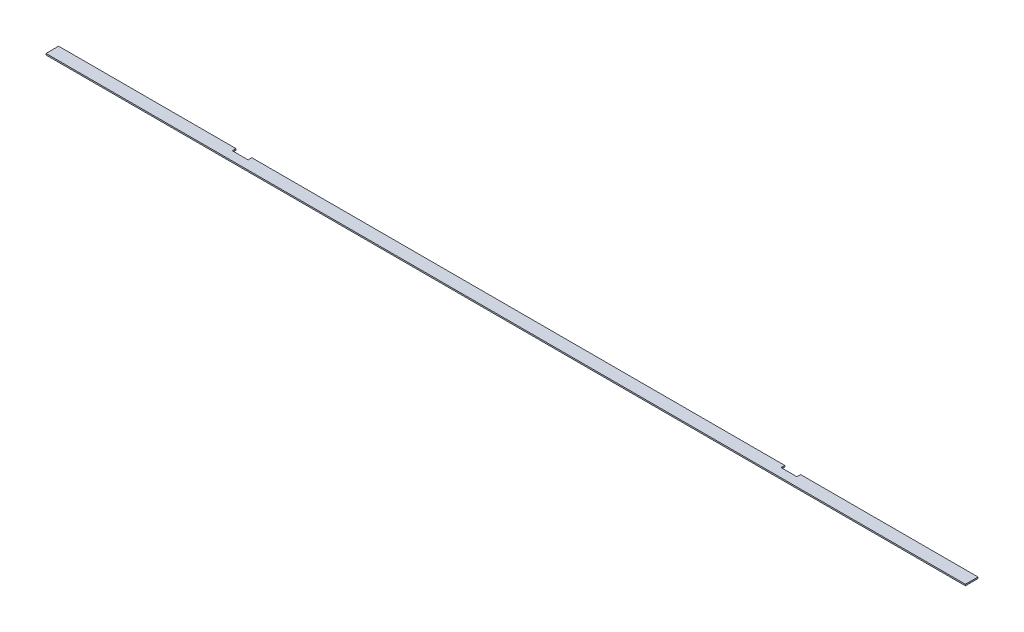
ISO-10303-21;
HEADER;
FILE_DESCRIPTION(('STEP AP214'),'2;1');
FILE_NAME('part.step','',(''),(''),'','','');
FILE_SCHEMA(('AUTOMOTIVE_DESIGN { 1 0 10303 214 1 1 1 1 }'));
ENDSEC;
DATA;
#1=APPLICATION_CONTEXT('core data for automotive mechanical design processes');
#2=APPLICATION_PROTOCOL_DEFINITION('international standard','automotive_design',2000,#1);
#3=PRODUCT_CONTEXT('',#1,'mechanical');
#4=PRODUCT('Part','Part','',(#3));
#5=PRODUCT_RELATED_PRODUCT_CATEGORY('part','',(#4));
#6=PRODUCT_DEFINITION_FORMATION('','',#4);
#7=PRODUCT_DEFINITION_CONTEXT('part definition',#1,'design');
#8=PRODUCT_DEFINITION('design','',#6,#7);
#9=PRODUCT_DEFINITION_SHAPE('','',#8);
#10=(LENGTH_UNIT() NAMED_UNIT(*) SI_UNIT(.MILLI.,.METRE.));
#11=(NAMED_UNIT(*) PLANE_ANGLE_UNIT() SI_UNIT($,.RADIAN.));
#12=(NAMED_UNIT(*) SI_UNIT($,.STERADIAN.) SOLID_ANGLE_UNIT());
#13=UNCERTAINTY_MEASURE_WITH_UNIT(LENGTH_MEASURE(1.E-05),#10,'distance_accuracy_value','');
#14=(GEOMETRIC_REPRESENTATION_CONTEXT(3) GLOBAL_UNCERTAINTY_ASSIGNED_CONTEXT((#13)) GLOBAL_UNIT_ASSIGNED_CONTEXT((#10,
#11,#12)) REPRESENTATION_CONTEXT('',''));
#15=CARTESIAN_POINT('',(0.,0.,0.));
#16=DIRECTION('',(0.,0.,1.));
#17=DIRECTION('',(1.,0.,0.));
#18=AXIS2_PLACEMENT_3D('',#15,#16,#17);
#19=CARTESIAN_POINT('',(985.,-1.5,-13.5));
#20=DIRECTION('',(0.,0.,1.));
#21=DIRECTION('',(1.,0.,0.));
#22=AXIS2_PLACEMENT_3D('',#19,#20,#21);
#23=PLANE('',#22);
#24=DIRECTION('',(0.,1.,0.));
#25=VECTOR('',#24,1.);
#26=CARTESIAN_POINT('',(605.000000000009,1.501,-13.5));
#27=LINE('',#26,#25);
#28=CARTESIAN_POINT('',(605.000000000009,-1.5,-13.5));
#29=VERTEX_POINT('',#28);
#30=CARTESIAN_POINT('',(605.000000000009,1.5,-13.5));
#31=VERTEX_POINT('',#30);
#32=EDGE_CURVE('E139',#29,#31,#27,.T.);
#33=ORIENTED_EDGE('',*,*,#32,.T.);
#34=DIRECTION('',(-1.,0.,0.));
#35=VECTOR('',#34,1.);
#36=CARTESIAN_POINT('',(985.,1.5,-13.5));
#37=LINE('',#36,#35);
#38=CARTESIAN_POINT('',(985.,1.5,-13.5));
#39=VERTEX_POINT('',#38);
#40=EDGE_CURVE('E11',#39,#31,#37,.T.);
#41=ORIENTED_EDGE('',*,*,#40,.F.);
#42=DIRECTION('',(0.,1.,0.));
#43=VECTOR('',#42,1.);
#44=CARTESIAN_POINT('',(985.,-1.5,-13.5));
#45=LINE('',#44,#43);
#46=CARTESIAN_POINT('',(985.,-1.5,-13.5));
#47=VERTEX_POINT('',#46);
#48=EDGE_CURVE('E203',#47,#39,#45,.T.);
#49=ORIENTED_EDGE('',*,*,#48,.F.);
#50=DIRECTION('',(-1.,0.,0.));
#51=VECTOR('',#50,1.);
#52=CARTESIAN_POINT('',(985.,-1.5,-13.5));
#53=LINE('',#52,#51);
#54=EDGE_CURVE('E146',#47,#29,#53,.T.);
#55=ORIENTED_EDGE('',*,*,#54,.T.);
#56=EDGE_LOOP('',(#33,#41,#49,#55));
#57=FACE_BOUND('',#56,.T.);
#58=ADVANCED_FACE('F35',(#57),#23,.F.);
#59=DIRECTION('',(0.,-1.,0.));
#60=VECTOR('',#59,1.);
#61=CARTESIAN_POINT('',(571.00000000001,1.501,-13.5));
#62=LINE('',#61,#60);
#63=CARTESIAN_POINT('',(571.00000000001,1.5,-13.5));
#64=VERTEX_POINT('',#63);
#65=CARTESIAN_POINT('',(571.00000000001,-1.5,-13.5));
#66=VERTEX_POINT('',#65);
#67=EDGE_CURVE('E128',#64,#66,#62,.T.);
#68=ORIENTED_EDGE('',*,*,#67,.T.);
#69=CARTESIAN_POINT('',(-571.000000000009,-1.5,-13.5));
#70=VERTEX_POINT('',#69);
#71=EDGE_CURVE('E58',#66,#70,#53,.T.);
#72=ORIENTED_EDGE('',*,*,#71,.T.);
#73=DIRECTION('',(0.,-1.,0.));
#74=VECTOR('',#73,1.);
#75=CARTESIAN_POINT('',(-571.00000000001,1.501,-13.5));
#76=LINE('',#75,#74);
#77=CARTESIAN_POINT('',(-571.00000000001,1.5,-13.5));
#78=VERTEX_POINT('',#77);
#79=EDGE_CURVE('E177',#78,#70,#76,.T.);
#80=ORIENTED_EDGE('',*,*,#79,.F.);
#81=EDGE_CURVE('E42',#64,#78,#37,.T.);
#82=ORIENTED_EDGE('',*,*,#81,.F.);
#83=EDGE_LOOP('',(#68,#72,#80,#82));
#84=FACE_BOUND('',#83,.T.);
#85=ADVANCED_FACE('F138',(#84),#23,.F.);
#86=CARTESIAN_POINT('',(985.,1.49999999999999,13.5));
#87=DIRECTION('',(0.,-1.,0.));
#88=DIRECTION('',(0.,0.,-1.));
#89=AXIS2_PLACEMENT_3D('',#86,#87,#88);
#90=PLANE('',#89);
#91=DIRECTION('',(0.,0.,1.));
#92=VECTOR('',#91,1.);
#93=CARTESIAN_POINT('',(605.000000000009,1.5,-5.5));
#94=LINE('',#93,#92);
#95=CARTESIAN_POINT('',(605.000000000009,1.5,-5.5));
#96=VERTEX_POINT('',#95);
#97=EDGE_CURVE('E273',#31,#96,#94,.T.);
#98=ORIENTED_EDGE('',*,*,#97,.T.);
#99=DIRECTION('',(-1.,0.,0.));
#100=VECTOR('',#99,1.);
#101=CARTESIAN_POINT('',(605.000000000009,1.5,-5.5));
#102=LINE('',#101,#100);
#103=CARTESIAN_POINT('',(571.00000000001,1.5,-5.5));
#104=VERTEX_POINT('',#103);
#105=EDGE_CURVE('E184',#96,#104,#102,.T.);
#106=ORIENTED_EDGE('',*,*,#105,.T.);
#107=DIRECTION('',(0.,0.,-1.));
#108=VECTOR('',#107,1.);
#109=CARTESIAN_POINT('',(571.00000000001,1.5,-5.5));
#110=LINE('',#109,#108);
#111=EDGE_CURVE('E174',#104,#64,#110,.T.);
#112=ORIENTED_EDGE('',*,*,#111,.T.);
#113=ORIENTED_EDGE('',*,*,#81,.T.);
#114=DIRECTION('',(0.,0.,-1.));
#115=VECTOR('',#114,1.);
#116=CARTESIAN_POINT('',(-571.00000000001,1.5,-5.5));
#117=LINE('',#116,#115);
#118=CARTESIAN_POINT('',(-571.00000000001,1.5,-5.5));
#119=VERTEX_POINT('',#118);
#120=EDGE_CURVE('E172',#119,#78,#117,.T.);
#121=ORIENTED_EDGE('',*,*,#120,.F.);
#122=DIRECTION('',(1.,0.,0.));
#123=VECTOR('',#122,1.);
#124=CARTESIAN_POINT('',(-605.000000000009,1.5,-5.5));
#125=LINE('',#124,#123);
#126=CARTESIAN_POINT('',(-605.000000000009,1.5,-5.5));
#127=VERTEX_POINT('',#126);
#128=EDGE_CURVE('E186',#127,#119,#125,.T.);
#129=ORIENTED_EDGE('',*,*,#128,.F.);
#130=DIRECTION('',(0.,0.,1.));
#131=VECTOR('',#130,1.);
#132=CARTESIAN_POINT('',(-605.000000000009,1.5,-5.5));
#133=LINE('',#132,#131);
#134=CARTESIAN_POINT('',(-605.000000000009,1.5,-13.5));
#135=VERTEX_POINT('',#134);
#136=EDGE_CURVE('E192',#135,#127,#133,.T.);
#137=ORIENTED_EDGE('',*,*,#136,.F.);
#138=CARTESIAN_POINT('',(-985.,1.5,-13.5));
#139=VERTEX_POINT('',#138);
#140=EDGE_CURVE('E43',#135,#139,#37,.T.);
#141=ORIENTED_EDGE('',*,*,#140,.T.);
#142=DIRECTION('',(0.,0.,1.));
#143=VECTOR('',#142,1.);
#144=CARTESIAN_POINT('',(-985.,1.49999999999999,13.5));
#145=LINE('',#144,#143);
#146=CARTESIAN_POINT('',(-985.,1.49999999999999,13.5));
#147=VERTEX_POINT('',#146);
#148=EDGE_CURVE('E213',#139,#147,#145,.T.);
#149=ORIENTED_EDGE('',*,*,#148,.T.);
#150=DIRECTION('',(-1.,0.,0.));
#151=VECTOR('',#150,1.);
#152=CARTESIAN_POINT('',(985.,1.49999999999999,13.5));
#153=LINE('',#152,#151);
#154=CARTESIAN_POINT('',(985.,1.49999999999999,13.5));
#155=VERTEX_POINT('',#154);
#156=EDGE_CURVE('E157',#155,#147,#153,.T.);
#157=ORIENTED_EDGE('',*,*,#156,.F.);
#158=DIRECTION('',(0.,0.,1.));
#159=VECTOR('',#158,1.);
#160=CARTESIAN_POINT('',(985.,1.49999999999999,13.5));
#161=LINE('',#160,#159);
#162=EDGE_CURVE('E206',#39,#155,#161,.T.);
#163=ORIENTED_EDGE('',*,*,#162,.F.);
#164=ORIENTED_EDGE('',*,*,#40,.T.);
#165=EDGE_LOOP('',(#98,#106,#112,#113,#121,#129,#137,#141,#149,#157,#163,#164));
#166=FACE_BOUND('',#165,.T.);
#167=ADVANCED_FACE('F170',(#166),#90,.F.);
#168=CARTESIAN_POINT('',(985.,-1.5,13.5));
#169=DIRECTION('',(0.,1.,0.));
#170=DIRECTION('',(0.,0.,1.));
#171=AXIS2_PLACEMENT_3D('',#168,#169,#170);
#172=PLANE('',#171);
#173=DIRECTION('',(0.,0.,-1.));
#174=VECTOR('',#173,1.);
#175=CARTESIAN_POINT('',(605.000000000009,-1.5,-5.5));
#176=LINE('',#175,#174);
#177=CARTESIAN_POINT('',(605.00000000001,-1.5,-5.5));
#178=VERTEX_POINT('',#177);
#179=EDGE_CURVE('E50',#178,#29,#176,.T.);
#180=ORIENTED_EDGE('',*,*,#179,.T.);
#181=ORIENTED_EDGE('',*,*,#54,.F.);
#182=DIRECTION('',(0.,0.,-1.));
#183=VECTOR('',#182,1.);
#184=CARTESIAN_POINT('',(985.,-1.5,13.5));
#185=LINE('',#184,#183);
#186=CARTESIAN_POINT('',(985.,-1.5,13.5));
#187=VERTEX_POINT('',#186);
#188=EDGE_CURVE('E151',#187,#47,#185,.T.);
#189=ORIENTED_EDGE('',*,*,#188,.F.);
#190=DIRECTION('',(-1.,0.,0.));
#191=VECTOR('',#190,1.);
#192=CARTESIAN_POINT('',(985.,-1.5,13.5));
#193=LINE('',#192,#191);
#194=CARTESIAN_POINT('',(-985.,-1.5,13.5));
#195=VERTEX_POINT('',#194);
#196=EDGE_CURVE('E150',#187,#195,#193,.T.);
#197=ORIENTED_EDGE('',*,*,#196,.T.);
#198=DIRECTION('',(0.,0.,-1.));
#199=VECTOR('',#198,1.);
#200=CARTESIAN_POINT('',(-985.,-1.5,13.5));
#201=LINE('',#200,#199);
#202=CARTESIAN_POINT('',(-985.,-1.5,-13.5));
#203=VERTEX_POINT('',#202);
#204=EDGE_CURVE('E154',#195,#203,#201,.T.);
#205=ORIENTED_EDGE('',*,*,#204,.T.);
#206=CARTESIAN_POINT('',(-605.000000000009,-1.5,-13.5));
#207=VERTEX_POINT('',#206);
#208=EDGE_CURVE('E147',#207,#203,#53,.T.);
#209=ORIENTED_EDGE('',*,*,#208,.F.);
#210=DIRECTION('',(0.,0.,-1.));
#211=VECTOR('',#210,1.);
#212=CARTESIAN_POINT('',(-605.000000000009,-1.5,-5.5));
#213=LINE('',#212,#211);
#214=CARTESIAN_POINT('',(-605.000000000009,-1.5,-5.5));
#215=VERTEX_POINT('',#214);
#216=EDGE_CURVE('E195',#215,#207,#213,.T.);
#217=ORIENTED_EDGE('',*,*,#216,.F.);
#218=DIRECTION('',(-1.,0.,0.));
#219=VECTOR('',#218,1.);
#220=CARTESIAN_POINT('',(-605.000000000009,-1.5,-5.5));
#221=LINE('',#220,#219);
#222=CARTESIAN_POINT('',(-571.00000000001,-1.5,-5.5));
#223=VERTEX_POINT('',#222);
#224=EDGE_CURVE('E198',#223,#215,#221,.T.);
#225=ORIENTED_EDGE('',*,*,#224,.F.);
#226=DIRECTION('',(0.,0.,1.));
#227=VECTOR('',#226,1.);
#228=CARTESIAN_POINT('',(-571.00000000001,-1.5,-5.5));
#229=LINE('',#228,#227);
#230=EDGE_CURVE('E145',#70,#223,#229,.T.);
#231=ORIENTED_EDGE('',*,*,#230,.F.);
#232=ORIENTED_EDGE('',*,*,#71,.F.);
#233=DIRECTION('',(0.,0.,1.));
#234=VECTOR('',#233,1.);
#235=CARTESIAN_POINT('',(571.00000000001,-1.5,-5.5));
#236=LINE('',#235,#234);
#237=CARTESIAN_POINT('',(571.00000000001,-1.5,-5.5));
#238=VERTEX_POINT('',#237);
#239=EDGE_CURVE('E125',#66,#238,#236,.T.);
#240=ORIENTED_EDGE('',*,*,#239,.T.);
#241=DIRECTION('',(1.,0.,0.));
#242=VECTOR('',#241,1.);
#243=CARTESIAN_POINT('',(605.000000000009,-1.5,-5.5));
#244=LINE('',#243,#242);
#245=EDGE_CURVE('E135',#238,#178,#244,.T.);
#246=ORIENTED_EDGE('',*,*,#245,.T.);
#247=EDGE_LOOP('',(#180,#181,#189,#197,#205,#209,#217,#225,#231,#232,#240,#246));
#248=FACE_BOUND('',#247,.T.);
#249=ADVANCED_FACE('F142',(#248),#172,.F.);
#250=ORIENTED_EDGE('',*,*,#140,.F.);
#251=DIRECTION('',(0.,1.,0.));
#252=VECTOR('',#251,1.);
#253=CARTESIAN_POINT('',(-605.000000000009,1.501,-13.5));
#254=LINE('',#253,#252);
#255=EDGE_CURVE('E183',#207,#135,#254,.T.);
#256=ORIENTED_EDGE('',*,*,#255,.F.);
#257=ORIENTED_EDGE('',*,*,#208,.T.);
#258=DIRECTION('',(0.,1.,0.));
#259=VECTOR('',#258,1.);
#260=CARTESIAN_POINT('',(-985.,-1.5,-13.5));
#261=LINE('',#260,#259);
#262=EDGE_CURVE('E180',#203,#139,#261,.T.);
#263=ORIENTED_EDGE('',*,*,#262,.T.);
#264=EDGE_LOOP('',(#250,#256,#257,#263));
#265=FACE_BOUND('',#264,.T.);
#266=ADVANCED_FACE('F225',(#265),#23,.F.);
#267=CARTESIAN_POINT('',(985.,-1.5,13.5));
#268=DIRECTION('',(0.,0.,-1.));
#269=DIRECTION('',(0.,1.,0.));
#270=AXIS2_PLACEMENT_3D('',#267,#268,#269);
#271=PLANE('',#270);
#272=DIRECTION('',(0.,-1.,0.));
#273=VECTOR('',#272,1.);
#274=CARTESIAN_POINT('',(-985.,-1.5,13.5));
#275=LINE('',#274,#273);
#276=EDGE_CURVE('E214',#147,#195,#275,.T.);
#277=ORIENTED_EDGE('',*,*,#276,.T.);
#278=ORIENTED_EDGE('',*,*,#196,.F.);
#279=DIRECTION('',(0.,-1.,0.));
#280=VECTOR('',#279,1.);
#281=CARTESIAN_POINT('',(985.,-1.5,13.5));
#282=LINE('',#281,#280);
#283=EDGE_CURVE('E208',#155,#187,#282,.T.);
#284=ORIENTED_EDGE('',*,*,#283,.F.);
#285=ORIENTED_EDGE('',*,*,#156,.T.);
#286=EDGE_LOOP('',(#277,#278,#284,#285));
#287=FACE_BOUND('',#286,.T.);
#288=ADVANCED_FACE('F249',(#287),#271,.F.);
#289=CARTESIAN_POINT('',(985.,0.,0.));
#290=DIRECTION('',(-1.,0.,0.));
#291=DIRECTION('',(0.,0.,1.));
#292=AXIS2_PLACEMENT_3D('',#289,#290,#291);
#293=PLANE('',#292);
#294=ORIENTED_EDGE('',*,*,#48,.T.);
#295=ORIENTED_EDGE('',*,*,#162,.T.);
#296=ORIENTED_EDGE('',*,*,#283,.T.);
#297=ORIENTED_EDGE('',*,*,#188,.T.);
#298=EDGE_LOOP('',(#294,#295,#296,#297));
#299=FACE_BOUND('',#298,.T.);
#300=ADVANCED_FACE('F255',(#299),#293,.F.);
#301=CARTESIAN_POINT('',(-985.,0.,0.));
#302=DIRECTION('',(-1.,0.,0.));
#303=DIRECTION('',(0.,0.,1.));
#304=AXIS2_PLACEMENT_3D('',#301,#302,#303);
#305=PLANE('',#304);
#306=ORIENTED_EDGE('',*,*,#262,.F.);
#307=ORIENTED_EDGE('',*,*,#204,.F.);
#308=ORIENTED_EDGE('',*,*,#276,.F.);
#309=ORIENTED_EDGE('',*,*,#148,.F.);
#310=EDGE_LOOP('',(#306,#307,#308,#309));
#311=FACE_BOUND('',#310,.T.);
#312=ADVANCED_FACE('F223',(#311),#305,.T.);
#313=CARTESIAN_POINT('',(-605.000000000009,1.501,-5.5));
#314=DIRECTION('',(-1.,0.,0.));
#315=DIRECTION('',(0.,0.,1.));
#316=AXIS2_PLACEMENT_3D('',#313,#314,#315);
#317=PLANE('',#316);
#318=ORIENTED_EDGE('',*,*,#255,.T.);
#319=ORIENTED_EDGE('',*,*,#136,.T.);
#320=DIRECTION('',(0.,-1.,0.));
#321=VECTOR('',#320,1.);
#322=CARTESIAN_POINT('',(-605.000000000009,1.501,-5.5));
#323=LINE('',#322,#321);
#324=EDGE_CURVE('E181',#127,#215,#323,.T.);
#325=ORIENTED_EDGE('',*,*,#324,.T.);
#326=ORIENTED_EDGE('',*,*,#216,.T.);
#327=EDGE_LOOP('',(#318,#319,#325,#326));
#328=FACE_BOUND('',#327,.T.);
#329=ADVANCED_FACE('F228',(#328),#317,.F.);
#330=CARTESIAN_POINT('',(-605.000000000009,1.501,-5.5));
#331=DIRECTION('',(0.,0.,1.));
#332=DIRECTION('',(0.,-1.,0.));
#333=AXIS2_PLACEMENT_3D('',#330,#331,#332);
#334=PLANE('',#333);
#335=ORIENTED_EDGE('',*,*,#128,.T.);
#336=DIRECTION('',(0.,-1.,0.));
#337=VECTOR('',#336,1.);
#338=CARTESIAN_POINT('',(-571.00000000001,1.501,-5.5));
#339=LINE('',#338,#337);
#340=EDGE_CURVE('E178',#119,#223,#339,.T.);
#341=ORIENTED_EDGE('',*,*,#340,.T.);
#342=ORIENTED_EDGE('',*,*,#224,.T.);
#343=ORIENTED_EDGE('',*,*,#324,.F.);
#344=EDGE_LOOP('',(#335,#341,#342,#343));
#345=FACE_BOUND('',#344,.T.);
#346=ADVANCED_FACE('F230',(#345),#334,.F.);
#347=CARTESIAN_POINT('',(-571.00000000001,1.501,-5.5));
#348=DIRECTION('',(1.,0.,0.));
#349=DIRECTION('',(0.,0.,-1.));
#350=AXIS2_PLACEMENT_3D('',#347,#348,#349);
#351=PLANE('',#350);
#352=ORIENTED_EDGE('',*,*,#79,.T.);
#353=ORIENTED_EDGE('',*,*,#230,.T.);
#354=ORIENTED_EDGE('',*,*,#340,.F.);
#355=ORIENTED_EDGE('',*,*,#120,.T.);
#356=EDGE_LOOP('',(#352,#353,#354,#355));
#357=FACE_BOUND('',#356,.T.);
#358=ADVANCED_FACE('F176',(#357),#351,.F.);
#359=CARTESIAN_POINT('',(605.000000000009,1.501,-5.5));
#360=DIRECTION('',(-1.,0.,0.));
#361=DIRECTION('',(0.,0.,1.));
#362=AXIS2_PLACEMENT_3D('',#359,#360,#361);
#363=PLANE('',#362);
#364=ORIENTED_EDGE('',*,*,#179,.F.);
#365=DIRECTION('',(0.,-1.,0.));
#366=VECTOR('',#365,1.);
#367=CARTESIAN_POINT('',(605.000000000009,1.501,-5.5));
#368=LINE('',#367,#366);
#369=EDGE_CURVE('E134',#96,#178,#368,.T.);
#370=ORIENTED_EDGE('',*,*,#369,.F.);
#371=ORIENTED_EDGE('',*,*,#97,.F.);
#372=ORIENTED_EDGE('',*,*,#32,.F.);
#373=EDGE_LOOP('',(#364,#370,#371,#372));
#374=FACE_BOUND('',#373,.T.);
#375=ADVANCED_FACE('F237',(#374),#363,.T.);
#376=CARTESIAN_POINT('',(571.00000000001,1.501,-5.5));
#377=DIRECTION('',(1.,0.,0.));
#378=DIRECTION('',(0.,0.,-1.));
#379=AXIS2_PLACEMENT_3D('',#376,#377,#378);
#380=PLANE('',#379);
#381=ORIENTED_EDGE('',*,*,#111,.F.);
#382=DIRECTION('',(0.,-1.,0.));
#383=VECTOR('',#382,1.);
#384=CARTESIAN_POINT('',(571.00000000001,1.501,-5.5));
#385=LINE('',#384,#383);
#386=EDGE_CURVE('E130',#104,#238,#385,.T.);
#387=ORIENTED_EDGE('',*,*,#386,.T.);
#388=ORIENTED_EDGE('',*,*,#239,.F.);
#389=ORIENTED_EDGE('',*,*,#67,.F.);
#390=EDGE_LOOP('',(#381,#387,#388,#389));
#391=FACE_BOUND('',#390,.T.);
#392=ADVANCED_FACE('F127',(#391),#380,.T.);
#393=CARTESIAN_POINT('',(605.000000000009,1.501,-5.5));
#394=DIRECTION('',(0.,0.,-1.));
#395=DIRECTION('',(0.,1.,0.));
#396=AXIS2_PLACEMENT_3D('',#393,#394,#395);
#397=PLANE('',#396);
#398=ORIENTED_EDGE('',*,*,#369,.T.);
#399=ORIENTED_EDGE('',*,*,#245,.F.);
#400=ORIENTED_EDGE('',*,*,#386,.F.);
#401=ORIENTED_EDGE('',*,*,#105,.F.);
#402=EDGE_LOOP('',(#398,#399,#400,#401));
#403=FACE_BOUND('',#402,.T.);
#404=ADVANCED_FACE('F281',(#403),#397,.T.);
#405=CLOSED_SHELL('',(#58,#85,#167,#249,#266,#288,#300,#312,#329,#346,#358,#375,#392,#404));
#406=MANIFOLD_SOLID_BREP('B2',#405);
#407=ADVANCED_BREP_SHAPE_REPRESENTATION('',(#18,#406),#14);
#408=SHAPE_DEFINITION_REPRESENTATION(#9,#407);
ENDSEC;
END-ISO-10303-21;
